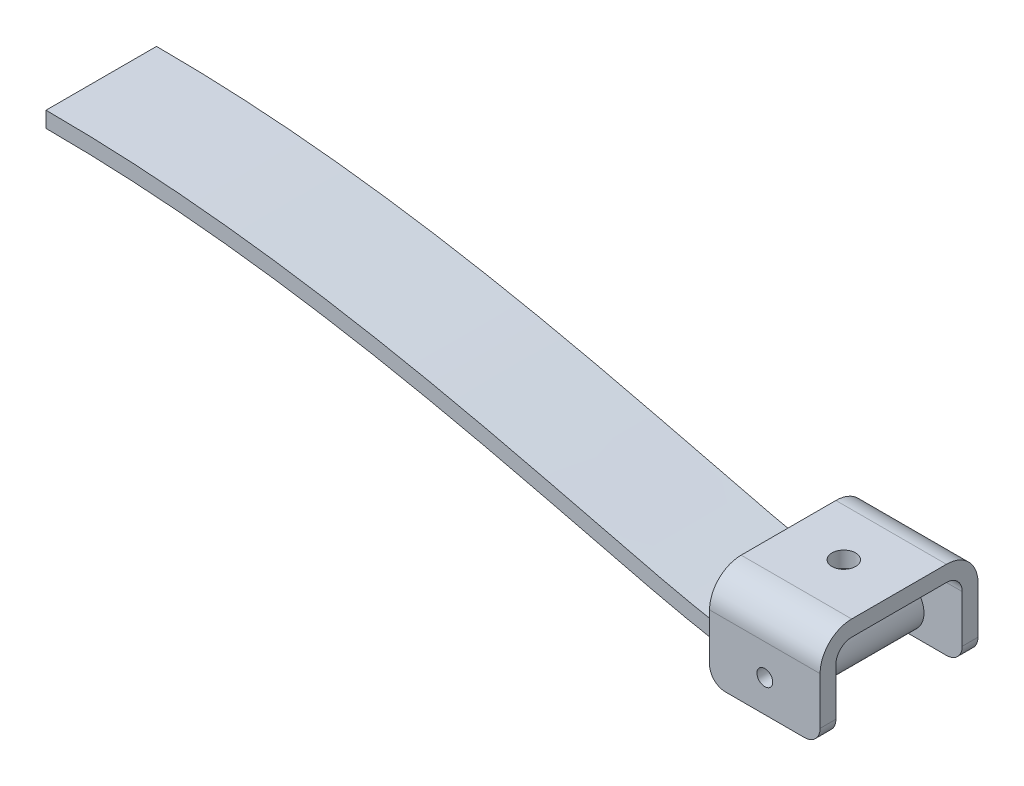
ISO-10303-21;
HEADER;
FILE_DESCRIPTION(('STEP AP214'),'2;1');
FILE_NAME('part.step','',(''),(''),'','','');
FILE_SCHEMA(('AUTOMOTIVE_DESIGN { 1 0 10303 214 1 1 1 1 }'));
ENDSEC;
DATA;
#1=APPLICATION_CONTEXT('core data for automotive mechanical design processes');
#2=APPLICATION_PROTOCOL_DEFINITION('international standard','automotive_design',2000,#1);
#3=PRODUCT_CONTEXT('',#1,'mechanical');
#4=PRODUCT('Part','Part','',(#3));
#5=PRODUCT_RELATED_PRODUCT_CATEGORY('part','',(#4));
#6=PRODUCT_DEFINITION_FORMATION('','',#4);
#7=PRODUCT_DEFINITION_CONTEXT('part definition',#1,'design');
#8=PRODUCT_DEFINITION('design','',#6,#7);
#9=PRODUCT_DEFINITION_SHAPE('','',#8);
#10=(LENGTH_UNIT() NAMED_UNIT(*) SI_UNIT(.MILLI.,.METRE.));
#11=(NAMED_UNIT(*) PLANE_ANGLE_UNIT() SI_UNIT($,.RADIAN.));
#12=(NAMED_UNIT(*) SI_UNIT($,.STERADIAN.) SOLID_ANGLE_UNIT());
#13=UNCERTAINTY_MEASURE_WITH_UNIT(LENGTH_MEASURE(1.E-05),#10,'distance_accuracy_value','');
#14=(GEOMETRIC_REPRESENTATION_CONTEXT(3) GLOBAL_UNCERTAINTY_ASSIGNED_CONTEXT((#13)) GLOBAL_UNIT_ASSIGNED_CONTEXT((#10,
#11,#12)) REPRESENTATION_CONTEXT('',''));
#15=CARTESIAN_POINT('',(0.,0.,0.));
#16=DIRECTION('',(0.,0.,1.));
#17=DIRECTION('',(1.,0.,0.));
#18=AXIS2_PLACEMENT_3D('',#15,#16,#17);
#19=CARTESIAN_POINT('',(31.75,15.6569971708173,-24.9059716634552));
#20=DIRECTION('',(0.,0.,-1.));
#21=DIRECTION('',(-1.,0.,0.));
#22=AXIS2_PLACEMENT_3D('',#19,#20,#21);
#23=PLANE('',#22);
#24=CARTESIAN_POINT('',(9.525,3.175,-24.9059716634552));
#25=DIRECTION('',(0.,0.,-1.));
#26=DIRECTION('',(-1.,0.,0.));
#27=AXIS2_PLACEMENT_3D('',#24,#25,#26);
#28=CIRCLE('',#27,3.175);
#29=CARTESIAN_POINT('',(6.35,3.175,-24.9059716634552));
#30=VERTEX_POINT('',#29);
#31=EDGE_CURVE('E207',#30,#30,#28,.T.);
#32=ORIENTED_EDGE('',*,*,#31,.T.);
#33=EDGE_LOOP('',(#32));
#34=FACE_BOUND('',#33,.T.);
#35=DIRECTION('',(-1.,0.,0.));
#36=VECTOR('',#35,1.);
#37=CARTESIAN_POINT('',(31.75,-9.74300282918273,-24.9059716634552));
#38=LINE('',#37,#36);
#39=CARTESIAN_POINT('',(25.4,-9.74300282918273,-24.9059716634552));
#40=VERTEX_POINT('',#39);
#41=CARTESIAN_POINT('',(-6.35,-9.74300282918273,-24.9059716634552));
#42=VERTEX_POINT('',#41);
#43=EDGE_CURVE('E251',#40,#42,#38,.T.);
#44=ORIENTED_EDGE('',*,*,#43,.F.);
#45=CARTESIAN_POINT('',(25.4,-3.39300282918273,-24.9059716634552));
#46=DIRECTION('',(0.,0.,-1.));
#47=DIRECTION('',(-1.,0.,0.));
#48=AXIS2_PLACEMENT_3D('',#45,#46,#47);
#49=CIRCLE('',#48,6.35);
#50=CARTESIAN_POINT('',(31.75,-3.39300282918273,-24.9059716634552));
#51=VERTEX_POINT('',#50);
#52=EDGE_CURVE('E265',#40,#51,#49,.F.);
#53=ORIENTED_EDGE('',*,*,#52,.T.);
#54=DIRECTION('',(0.,1.,0.));
#55=VECTOR('',#54,1.);
#56=CARTESIAN_POINT('',(31.75,15.6569971708173,-24.9059716634552));
#57=LINE('',#56,#55);
#58=CARTESIAN_POINT('',(31.75,15.6569971708173,-24.9059716634552));
#59=VERTEX_POINT('',#58);
#60=EDGE_CURVE('E182',#59,#51,#57,.F.);
#61=ORIENTED_EDGE('',*,*,#60,.F.);
#62=DIRECTION('',(-1.,0.,0.));
#63=VECTOR('',#62,1.);
#64=CARTESIAN_POINT('',(31.75,15.6569971708173,-24.9059716634552));
#65=LINE('',#64,#63);
#66=CARTESIAN_POINT('',(-12.7,15.6569971708173,-24.9059716634552));
#67=VERTEX_POINT('',#66);
#68=EDGE_CURVE('E203',#59,#67,#65,.T.);
#69=ORIENTED_EDGE('',*,*,#68,.T.);
#70=DIRECTION('',(0.,1.,0.));
#71=VECTOR('',#70,1.);
#72=CARTESIAN_POINT('',(-12.7,15.6569971708173,-24.9059716634552));
#73=LINE('',#72,#71);
#74=CARTESIAN_POINT('',(-12.7,-3.39300282918273,-24.9059716634552));
#75=VERTEX_POINT('',#74);
#76=EDGE_CURVE('E204',#67,#75,#73,.F.);
#77=ORIENTED_EDGE('',*,*,#76,.T.);
#78=CARTESIAN_POINT('',(-6.35,-3.39300282918273,-24.9059716634552));
#79=DIRECTION('',(0.,0.,-1.));
#80=DIRECTION('',(-1.,0.,0.));
#81=AXIS2_PLACEMENT_3D('',#78,#79,#80);
#82=CIRCLE('',#81,6.35);
#83=EDGE_CURVE('E263',#75,#42,#82,.F.);
#84=ORIENTED_EDGE('',*,*,#83,.T.);
#85=EDGE_LOOP('',(#44,#53,#61,#69,#77,#84));
#86=FACE_BOUND('',#85,.T.);
#87=ADVANCED_FACE('F45',(#34,#86),#23,.F.);
#88=CARTESIAN_POINT('',(31.75,-9.74300282918273,-31.2559716634552));
#89=DIRECTION('',(0.,-1.,0.));
#90=DIRECTION('',(0.,0.,-1.));
#91=AXIS2_PLACEMENT_3D('',#88,#89,#90);
#92=PLANE('',#91);
#93=DIRECTION('',(-1.,0.,0.));
#94=VECTOR('',#93,1.);
#95=CARTESIAN_POINT('',(31.75,-9.74300282918273,-31.2559716634552));
#96=LINE('',#95,#94);
#97=CARTESIAN_POINT('',(25.4,-9.74300282918273,-31.2559716634552));
#98=VERTEX_POINT('',#97);
#99=CARTESIAN_POINT('',(-6.35,-9.74300282918273,-31.2559716634552));
#100=VERTEX_POINT('',#99);
#101=EDGE_CURVE('E170',#98,#100,#96,.T.);
#102=ORIENTED_EDGE('',*,*,#101,.F.);
#103=DIRECTION('',(0.,0.,1.));
#104=VECTOR('',#103,1.);
#105=CARTESIAN_POINT('',(25.4,-9.74300282918273,-24.9059716634552));
#106=LINE('',#105,#104);
#107=EDGE_CURVE('E260',#98,#40,#106,.T.);
#108=ORIENTED_EDGE('',*,*,#107,.T.);
#109=ORIENTED_EDGE('',*,*,#43,.T.);
#110=DIRECTION('',(0.,0.,1.));
#111=VECTOR('',#110,1.);
#112=CARTESIAN_POINT('',(-6.35,-9.74300282918273,-31.2559716634552));
#113=LINE('',#112,#111);
#114=EDGE_CURVE('E254',#42,#100,#113,.F.);
#115=ORIENTED_EDGE('',*,*,#114,.T.);
#116=EDGE_LOOP('',(#102,#108,#109,#115));
#117=FACE_BOUND('',#116,.T.);
#118=ADVANCED_FACE('F328',(#117),#92,.T.);
#119=CARTESIAN_POINT('',(31.75,15.6569971708173,-31.2559716634552));
#120=DIRECTION('',(0.,0.,-1.));
#121=DIRECTION('',(-1.,0.,0.));
#122=AXIS2_PLACEMENT_3D('',#119,#120,#121);
#123=PLANE('',#122);
#124=CARTESIAN_POINT('',(9.525,3.175,-31.2559716634552));
#125=DIRECTION('',(0.,0.,1.));
#126=DIRECTION('',(1.,0.,0.));
#127=AXIS2_PLACEMENT_3D('',#124,#125,#126);
#128=CIRCLE('',#127,3.175);
#129=CARTESIAN_POINT('',(12.7,3.175,-31.2559716634552));
#130=VERTEX_POINT('',#129);
#131=EDGE_CURVE('E258',#130,#130,#128,.T.);
#132=ORIENTED_EDGE('',*,*,#131,.T.);
#133=EDGE_LOOP('',(#132));
#134=FACE_BOUND('',#133,.T.);
#135=DIRECTION('',(0.,-1.,0.));
#136=VECTOR('',#135,1.);
#137=CARTESIAN_POINT('',(31.75,15.6569971708173,-31.2559716634552));
#138=LINE('',#137,#136);
#139=CARTESIAN_POINT('',(31.75,15.6569971708173,-31.2559716634552));
#140=VERTEX_POINT('',#139);
#141=CARTESIAN_POINT('',(31.75,-3.39300282918273,-31.2559716634552));
#142=VERTEX_POINT('',#141);
#143=EDGE_CURVE('E162',#140,#142,#138,.T.);
#144=ORIENTED_EDGE('',*,*,#143,.T.);
#145=CARTESIAN_POINT('',(25.4,-3.39300282918273,-31.2559716634552));
#146=DIRECTION('',(0.,0.,-1.));
#147=DIRECTION('',(-1.,0.,0.));
#148=AXIS2_PLACEMENT_3D('',#145,#146,#147);
#149=CIRCLE('',#148,6.35);
#150=EDGE_CURVE('E272',#142,#98,#149,.T.);
#151=ORIENTED_EDGE('',*,*,#150,.T.);
#152=ORIENTED_EDGE('',*,*,#101,.T.);
#153=CARTESIAN_POINT('',(-6.35,-3.39300282918273,-31.2559716634552));
#154=DIRECTION('',(0.,0.,-1.));
#155=DIRECTION('',(-1.,0.,0.));
#156=AXIS2_PLACEMENT_3D('',#153,#154,#155);
#157=CIRCLE('',#156,6.35);
#158=CARTESIAN_POINT('',(-12.7,-3.39300282918273,-31.2559716634552));
#159=VERTEX_POINT('',#158);
#160=EDGE_CURVE('E270',#100,#159,#157,.T.);
#161=ORIENTED_EDGE('',*,*,#160,.T.);
#162=DIRECTION('',(0.,-1.,0.));
#163=VECTOR('',#162,1.);
#164=CARTESIAN_POINT('',(-12.7,15.6569971708173,-31.2559716634552));
#165=LINE('',#164,#163);
#166=CARTESIAN_POINT('',(-12.7,15.6569971708173,-31.2559716634552));
#167=VERTEX_POINT('',#166);
#168=EDGE_CURVE('E165',#167,#159,#165,.T.);
#169=ORIENTED_EDGE('',*,*,#168,.F.);
#170=DIRECTION('',(-1.,0.,0.));
#171=VECTOR('',#170,1.);
#172=CARTESIAN_POINT('',(31.75,15.6569971708173,-31.2559716634552));
#173=LINE('',#172,#171);
#174=EDGE_CURVE('E159',#140,#167,#173,.T.);
#175=ORIENTED_EDGE('',*,*,#174,.F.);
#176=EDGE_LOOP('',(#144,#151,#152,#161,#169,#175));
#177=FACE_BOUND('',#176,.T.);
#178=ADVANCED_FACE('F161',(#134,#177),#123,.T.);
#179=CARTESIAN_POINT('',(31.75,15.6569971708173,-18.5559716634552));
#180=DIRECTION('',(-1.,0.,0.));
#181=DIRECTION('',(0.,0.,1.));
#182=AXIS2_PLACEMENT_3D('',#179,#180,#181);
#183=CYLINDRICAL_SURFACE('',#182,12.7);
#184=CARTESIAN_POINT('',(-12.7,15.6569971708173,-18.5559716634552));
#185=DIRECTION('',(-1.,0.,0.));
#186=DIRECTION('',(0.,0.,1.));
#187=AXIS2_PLACEMENT_3D('',#184,#185,#186);
#188=CIRCLE('',#187,12.7);
#189=CARTESIAN_POINT('',(-12.7,28.3569971708173,-18.5559716634552));
#190=VERTEX_POINT('',#189);
#191=EDGE_CURVE('E209',#190,#167,#188,.T.);
#192=ORIENTED_EDGE('',*,*,#191,.F.);
#193=DIRECTION('',(-1.,0.,0.));
#194=VECTOR('',#193,1.);
#195=CARTESIAN_POINT('',(31.75,28.3569971708173,-18.5559716634552));
#196=LINE('',#195,#194);
#197=CARTESIAN_POINT('',(31.75,28.3569971708173,-18.5559716634552));
#198=VERTEX_POINT('',#197);
#199=EDGE_CURVE('E171',#198,#190,#196,.T.);
#200=ORIENTED_EDGE('',*,*,#199,.F.);
#201=CARTESIAN_POINT('',(31.75,15.6569971708173,-18.5559716634552));
#202=DIRECTION('',(-1.,0.,0.));
#203=DIRECTION('',(0.,0.,1.));
#204=AXIS2_PLACEMENT_3D('',#201,#202,#203);
#205=CIRCLE('',#204,12.7);
#206=EDGE_CURVE('E178',#198,#140,#205,.T.);
#207=ORIENTED_EDGE('',*,*,#206,.T.);
#208=ORIENTED_EDGE('',*,*,#174,.T.);
#209=EDGE_LOOP('',(#192,#200,#207,#208));
#210=FACE_BOUND('',#209,.T.);
#211=ADVANCED_FACE('F184',(#210),#183,.T.);
#212=CARTESIAN_POINT('',(31.75,28.3569971708173,19.5440283365448));
#213=DIRECTION('',(0.,1.,0.));
#214=DIRECTION('',(0.,0.,1.));
#215=AXIS2_PLACEMENT_3D('',#212,#213,#214);
#216=PLANE('',#215);
#217=CARTESIAN_POINT('',(9.525,28.3569971708173,0.494028336544765));
#218=DIRECTION('',(0.,1.,0.));
#219=DIRECTION('',(0.,0.,1.));
#220=AXIS2_PLACEMENT_3D('',#217,#218,#219);
#221=CIRCLE('',#220,4.7625);
#222=CARTESIAN_POINT('',(9.525,28.3569971708173,5.25652833654476));
#223=VERTEX_POINT('',#222);
#224=EDGE_CURVE('E491',#223,#223,#221,.T.);
#225=ORIENTED_EDGE('',*,*,#224,.F.);
#226=EDGE_LOOP('',(#225));
#227=FACE_BOUND('',#226,.T.);
#228=DIRECTION('',(0.,0.,-1.));
#229=VECTOR('',#228,1.);
#230=CARTESIAN_POINT('',(-12.7,28.3569971708173,19.5440283365448));
#231=LINE('',#230,#229);
#232=CARTESIAN_POINT('',(-12.7,28.3569971708173,19.5440283365448));
#233=VERTEX_POINT('',#232);
#234=EDGE_CURVE('E211',#233,#190,#231,.T.);
#235=ORIENTED_EDGE('',*,*,#234,.F.);
#236=DIRECTION('',(-1.,0.,0.));
#237=VECTOR('',#236,1.);
#238=CARTESIAN_POINT('',(31.75,28.3569971708173,19.5440283365448));
#239=LINE('',#238,#237);
#240=CARTESIAN_POINT('',(31.75,28.3569971708173,19.5440283365448));
#241=VERTEX_POINT('',#240);
#242=EDGE_CURVE('E246',#241,#233,#239,.T.);
#243=ORIENTED_EDGE('',*,*,#242,.F.);
#244=DIRECTION('',(0.,0.,-1.));
#245=VECTOR('',#244,1.);
#246=CARTESIAN_POINT('',(31.75,28.3569971708173,19.5440283365448));
#247=LINE('',#246,#245);
#248=EDGE_CURVE('E185',#241,#198,#247,.T.);
#249=ORIENTED_EDGE('',*,*,#248,.T.);
#250=ORIENTED_EDGE('',*,*,#199,.T.);
#251=EDGE_LOOP('',(#235,#243,#249,#250));
#252=FACE_BOUND('',#251,.T.);
#253=ADVANCED_FACE('F338',(#227,#252),#216,.T.);
#254=CARTESIAN_POINT('',(31.75,15.6569971708173,19.5440283365448));
#255=DIRECTION('',(-1.,0.,0.));
#256=DIRECTION('',(0.,0.,1.));
#257=AXIS2_PLACEMENT_3D('',#254,#255,#256);
#258=CYLINDRICAL_SURFACE('',#257,12.7);
#259=CARTESIAN_POINT('',(-12.7,15.6569971708173,19.5440283365448));
#260=DIRECTION('',(-1.,0.,0.));
#261=DIRECTION('',(0.,0.,1.));
#262=AXIS2_PLACEMENT_3D('',#259,#260,#261);
#263=CIRCLE('',#262,12.7);
#264=CARTESIAN_POINT('',(-12.7,15.6569971708173,32.2440283365448));
#265=VERTEX_POINT('',#264);
#266=EDGE_CURVE('E214',#265,#233,#263,.T.);
#267=ORIENTED_EDGE('',*,*,#266,.F.);
#268=DIRECTION('',(-1.,0.,0.));
#269=VECTOR('',#268,1.);
#270=CARTESIAN_POINT('',(31.75,15.6569971708173,32.2440283365448));
#271=LINE('',#270,#269);
#272=CARTESIAN_POINT('',(31.75,15.6569971708173,32.2440283365448));
#273=VERTEX_POINT('',#272);
#274=EDGE_CURVE('E243',#273,#265,#271,.T.);
#275=ORIENTED_EDGE('',*,*,#274,.F.);
#276=CARTESIAN_POINT('',(31.75,15.6569971708173,19.5440283365448));
#277=DIRECTION('',(-1.,0.,0.));
#278=DIRECTION('',(0.,0.,1.));
#279=AXIS2_PLACEMENT_3D('',#276,#277,#278);
#280=CIRCLE('',#279,12.7);
#281=EDGE_CURVE('E187',#273,#241,#280,.T.);
#282=ORIENTED_EDGE('',*,*,#281,.T.);
#283=ORIENTED_EDGE('',*,*,#242,.T.);
#284=EDGE_LOOP('',(#267,#275,#282,#283));
#285=FACE_BOUND('',#284,.T.);
#286=ADVANCED_FACE('F340',(#285),#258,.T.);
#287=CARTESIAN_POINT('',(31.75,-9.74300282918272,32.2440283365448));
#288=DIRECTION('',(0.,0.,1.));
#289=DIRECTION('',(1.,0.,0.));
#290=AXIS2_PLACEMENT_3D('',#287,#288,#289);
#291=PLANE('',#290);
#292=CARTESIAN_POINT('',(9.525,3.175,32.2440283365448));
#293=DIRECTION('',(0.,0.,1.));
#294=DIRECTION('',(1.,0.,0.));
#295=AXIS2_PLACEMENT_3D('',#292,#293,#294);
#296=CIRCLE('',#295,3.175);
#297=CARTESIAN_POINT('',(12.7,3.175,32.2440283365448));
#298=VERTEX_POINT('',#297);
#299=EDGE_CURVE('E484',#298,#298,#296,.T.);
#300=ORIENTED_EDGE('',*,*,#299,.F.);
#301=EDGE_LOOP('',(#300));
#302=FACE_BOUND('',#301,.T.);
#303=DIRECTION('',(-1.,0.,0.));
#304=VECTOR('',#303,1.);
#305=CARTESIAN_POINT('',(31.75,-9.74300282918272,32.2440283365448));
#306=LINE('',#305,#304);
#307=CARTESIAN_POINT('',(25.4,-9.74300282918272,32.2440283365448));
#308=VERTEX_POINT('',#307);
#309=CARTESIAN_POINT('',(-6.35,-9.74300282918272,32.2440283365448));
#310=VERTEX_POINT('',#309);
#311=EDGE_CURVE('E241',#308,#310,#306,.T.);
#312=ORIENTED_EDGE('',*,*,#311,.F.);
#313=CARTESIAN_POINT('',(25.4,-3.39300282918272,32.2440283365448));
#314=DIRECTION('',(0.,0.,1.));
#315=DIRECTION('',(1.,0.,0.));
#316=AXIS2_PLACEMENT_3D('',#313,#314,#315);
#317=CIRCLE('',#316,6.35);
#318=CARTESIAN_POINT('',(31.75,-3.39300282918272,32.2440283365448));
#319=VERTEX_POINT('',#318);
#320=EDGE_CURVE('E68',#308,#319,#317,.T.);
#321=ORIENTED_EDGE('',*,*,#320,.T.);
#322=DIRECTION('',(0.,1.,0.));
#323=VECTOR('',#322,1.);
#324=CARTESIAN_POINT('',(31.75,-9.74300282918272,32.2440283365448));
#325=LINE('',#324,#323);
#326=EDGE_CURVE('E193',#319,#273,#325,.T.);
#327=ORIENTED_EDGE('',*,*,#326,.T.);
#328=ORIENTED_EDGE('',*,*,#274,.T.);
#329=DIRECTION('',(0.,1.,0.));
#330=VECTOR('',#329,1.);
#331=CARTESIAN_POINT('',(-12.7,-9.74300282918272,32.2440283365448));
#332=LINE('',#331,#330);
#333=CARTESIAN_POINT('',(-12.7,-3.39300282918273,32.2440283365448));
#334=VERTEX_POINT('',#333);
#335=EDGE_CURVE('E217',#334,#265,#332,.T.);
#336=ORIENTED_EDGE('',*,*,#335,.F.);
#337=CARTESIAN_POINT('',(-6.35,-3.39300282918273,32.2440283365448));
#338=DIRECTION('',(0.,0.,1.));
#339=DIRECTION('',(1.,0.,0.));
#340=AXIS2_PLACEMENT_3D('',#337,#338,#339);
#341=CIRCLE('',#340,6.35);
#342=EDGE_CURVE('E60',#334,#310,#341,.T.);
#343=ORIENTED_EDGE('',*,*,#342,.T.);
#344=EDGE_LOOP('',(#312,#321,#327,#328,#336,#343));
#345=FACE_BOUND('',#344,.T.);
#346=ADVANCED_FACE('F301',(#302,#345),#291,.T.);
#347=CARTESIAN_POINT('',(31.75,-9.74300282918272,25.8940283365448));
#348=DIRECTION('',(0.,-1.,0.));
#349=DIRECTION('',(0.,0.,-1.));
#350=AXIS2_PLACEMENT_3D('',#347,#348,#349);
#351=PLANE('',#350);
#352=DIRECTION('',(-1.,0.,0.));
#353=VECTOR('',#352,1.);
#354=CARTESIAN_POINT('',(31.75,-9.74300282918272,25.8940283365448));
#355=LINE('',#354,#353);
#356=CARTESIAN_POINT('',(25.4,-9.74300282918272,25.8940283365448));
#357=VERTEX_POINT('',#356);
#358=CARTESIAN_POINT('',(-6.35,-9.74300282918272,25.8940283365448));
#359=VERTEX_POINT('',#358);
#360=EDGE_CURVE('E238',#357,#359,#355,.T.);
#361=ORIENTED_EDGE('',*,*,#360,.F.);
#362=DIRECTION('',(0.,0.,1.));
#363=VECTOR('',#362,1.);
#364=CARTESIAN_POINT('',(25.4,-9.74300282918272,32.2440283365448));
#365=LINE('',#364,#363);
#366=EDGE_CURVE('E282',#357,#308,#365,.T.);
#367=ORIENTED_EDGE('',*,*,#366,.T.);
#368=ORIENTED_EDGE('',*,*,#311,.T.);
#369=DIRECTION('',(0.,0.,1.));
#370=VECTOR('',#369,1.);
#371=CARTESIAN_POINT('',(-6.35,-9.74300282918272,25.8940283365448));
#372=LINE('',#371,#370);
#373=EDGE_CURVE('E280',#310,#359,#372,.F.);
#374=ORIENTED_EDGE('',*,*,#373,.T.);
#375=EDGE_LOOP('',(#361,#367,#368,#374));
#376=FACE_BOUND('',#375,.T.);
#377=ADVANCED_FACE('F300',(#376),#351,.T.);
#378=CARTESIAN_POINT('',(31.75,-9.74300282918272,25.8940283365448));
#379=DIRECTION('',(0.,0.,1.));
#380=DIRECTION('',(1.,0.,0.));
#381=AXIS2_PLACEMENT_3D('',#378,#379,#380);
#382=PLANE('',#381);
#383=CARTESIAN_POINT('',(9.525,3.175,25.8940283365448));
#384=DIRECTION('',(0.,0.,1.));
#385=DIRECTION('',(1.,0.,0.));
#386=AXIS2_PLACEMENT_3D('',#383,#384,#385);
#387=CIRCLE('',#386,3.175);
#388=CARTESIAN_POINT('',(12.7,3.175,25.8940283365448));
#389=VERTEX_POINT('',#388);
#390=EDGE_CURVE('E255',#389,#389,#387,.T.);
#391=ORIENTED_EDGE('',*,*,#390,.T.);
#392=EDGE_LOOP('',(#391));
#393=FACE_BOUND('',#392,.T.);
#394=DIRECTION('',(0.,1.,0.));
#395=VECTOR('',#394,1.);
#396=CARTESIAN_POINT('',(31.75,-9.74300282918272,25.8940283365448));
#397=LINE('',#396,#395);
#398=CARTESIAN_POINT('',(31.75,-3.39300282918272,25.8940283365448));
#399=VERTEX_POINT('',#398);
#400=CARTESIAN_POINT('',(31.75,15.6569971708173,25.8940283365448));
#401=VERTEX_POINT('',#400);
#402=EDGE_CURVE('E195',#399,#401,#397,.T.);
#403=ORIENTED_EDGE('',*,*,#402,.F.);
#404=CARTESIAN_POINT('',(25.4,-3.39300282918272,25.8940283365448));
#405=DIRECTION('',(0.,0.,1.));
#406=DIRECTION('',(1.,0.,0.));
#407=AXIS2_PLACEMENT_3D('',#404,#405,#406);
#408=CIRCLE('',#407,6.35);
#409=EDGE_CURVE('E12',#399,#357,#408,.F.);
#410=ORIENTED_EDGE('',*,*,#409,.T.);
#411=ORIENTED_EDGE('',*,*,#360,.T.);
#412=CARTESIAN_POINT('',(-6.35,-3.39300282918273,25.8940283365448));
#413=DIRECTION('',(0.,0.,1.));
#414=DIRECTION('',(1.,0.,0.));
#415=AXIS2_PLACEMENT_3D('',#412,#413,#414);
#416=CIRCLE('',#415,6.35);
#417=CARTESIAN_POINT('',(-12.7,-3.39300282918273,25.8940283365448));
#418=VERTEX_POINT('',#417);
#419=EDGE_CURVE('E53',#359,#418,#416,.F.);
#420=ORIENTED_EDGE('',*,*,#419,.T.);
#421=DIRECTION('',(0.,1.,0.));
#422=VECTOR('',#421,1.);
#423=CARTESIAN_POINT('',(-12.7,-9.74300282918272,25.8940283365448));
#424=LINE('',#423,#422);
#425=CARTESIAN_POINT('',(-12.7,15.6569971708173,25.8940283365448));
#426=VERTEX_POINT('',#425);
#427=EDGE_CURVE('E219',#418,#426,#424,.T.);
#428=ORIENTED_EDGE('',*,*,#427,.T.);
#429=DIRECTION('',(-1.,0.,0.));
#430=VECTOR('',#429,1.);
#431=CARTESIAN_POINT('',(31.75,15.6569971708173,25.8940283365448));
#432=LINE('',#431,#430);
#433=EDGE_CURVE('E235',#401,#426,#432,.T.);
#434=ORIENTED_EDGE('',*,*,#433,.F.);
#435=EDGE_LOOP('',(#403,#410,#411,#420,#428,#434));
#436=FACE_BOUND('',#435,.T.);
#437=ADVANCED_FACE('F289',(#393,#436),#382,.F.);
#438=CARTESIAN_POINT('',(31.75,15.6569971708173,19.5440283365448));
#439=DIRECTION('',(-1.,0.,0.));
#440=DIRECTION('',(0.,0.,1.));
#441=AXIS2_PLACEMENT_3D('',#438,#439,#440);
#442=CYLINDRICAL_SURFACE('',#441,6.35);
#443=CARTESIAN_POINT('',(-12.7,15.6569971708173,19.5440283365448));
#444=DIRECTION('',(1.,0.,0.));
#445=DIRECTION('',(0.,0.,-1.));
#446=AXIS2_PLACEMENT_3D('',#443,#444,#445);
#447=CIRCLE('',#446,6.35);
#448=CARTESIAN_POINT('',(-12.7,22.0069971708173,19.5440283365448));
#449=VERTEX_POINT('',#448);
#450=EDGE_CURVE('E221',#426,#449,#447,.F.);
#451=ORIENTED_EDGE('',*,*,#450,.T.);
#452=DIRECTION('',(-1.,0.,0.));
#453=VECTOR('',#452,1.);
#454=CARTESIAN_POINT('',(31.75,22.0069971708173,19.5440283365448));
#455=LINE('',#454,#453);
#456=CARTESIAN_POINT('',(31.75,22.0069971708173,19.5440283365448));
#457=VERTEX_POINT('',#456);
#458=EDGE_CURVE('E232',#457,#449,#455,.T.);
#459=ORIENTED_EDGE('',*,*,#458,.F.);
#460=CARTESIAN_POINT('',(31.75,15.6569971708173,19.5440283365448));
#461=DIRECTION('',(1.,0.,0.));
#462=DIRECTION('',(0.,0.,-1.));
#463=AXIS2_PLACEMENT_3D('',#460,#461,#462);
#464=CIRCLE('',#463,6.35);
#465=EDGE_CURVE('E197',#401,#457,#464,.F.);
#466=ORIENTED_EDGE('',*,*,#465,.F.);
#467=ORIENTED_EDGE('',*,*,#433,.T.);
#468=EDGE_LOOP('',(#451,#459,#466,#467));
#469=FACE_BOUND('',#468,.T.);
#470=ADVANCED_FACE('F312',(#469),#442,.F.);
#471=CARTESIAN_POINT('',(31.75,22.0069971708173,19.5440283365448));
#472=DIRECTION('',(0.,1.,0.));
#473=DIRECTION('',(0.,0.,1.));
#474=AXIS2_PLACEMENT_3D('',#471,#472,#473);
#475=PLANE('',#474);
#476=CARTESIAN_POINT('',(9.525,22.0069971708173,0.494028336544765));
#477=DIRECTION('',(0.,1.,0.));
#478=DIRECTION('',(0.,0.,1.));
#479=AXIS2_PLACEMENT_3D('',#476,#477,#478);
#480=CIRCLE('',#479,4.7625);
#481=CARTESIAN_POINT('',(9.525,22.0069971708173,5.25652833654476));
#482=VERTEX_POINT('',#481);
#483=EDGE_CURVE('E486',#482,#482,#480,.T.);
#484=ORIENTED_EDGE('',*,*,#483,.T.);
#485=EDGE_LOOP('',(#484));
#486=FACE_BOUND('',#485,.T.);
#487=DIRECTION('',(0.,0.,-1.));
#488=VECTOR('',#487,1.);
#489=CARTESIAN_POINT('',(-12.7,22.0069971708173,19.5440283365448));
#490=LINE('',#489,#488);
#491=CARTESIAN_POINT('',(-12.7,22.0069971708173,-18.5559716634552));
#492=VERTEX_POINT('',#491);
#493=EDGE_CURVE('E223',#449,#492,#490,.T.);
#494=ORIENTED_EDGE('',*,*,#493,.T.);
#495=DIRECTION('',(-1.,0.,0.));
#496=VECTOR('',#495,1.);
#497=CARTESIAN_POINT('',(31.75,22.0069971708173,-18.5559716634552));
#498=LINE('',#497,#496);
#499=CARTESIAN_POINT('',(31.75,22.0069971708173,-18.5559716634552));
#500=VERTEX_POINT('',#499);
#501=EDGE_CURVE('E229',#500,#492,#498,.T.);
#502=ORIENTED_EDGE('',*,*,#501,.F.);
#503=DIRECTION('',(0.,0.,-1.));
#504=VECTOR('',#503,1.);
#505=CARTESIAN_POINT('',(31.75,22.0069971708173,19.5440283365448));
#506=LINE('',#505,#504);
#507=EDGE_CURVE('E199',#457,#500,#506,.T.);
#508=ORIENTED_EDGE('',*,*,#507,.F.);
#509=ORIENTED_EDGE('',*,*,#458,.T.);
#510=EDGE_LOOP('',(#494,#502,#508,#509));
#511=FACE_BOUND('',#510,.T.);
#512=ADVANCED_FACE('F314',(#486,#511),#475,.F.);
#513=CARTESIAN_POINT('',(31.75,15.6569971708173,-18.5559716634552));
#514=DIRECTION('',(-1.,0.,0.));
#515=DIRECTION('',(0.,0.,1.));
#516=AXIS2_PLACEMENT_3D('',#513,#514,#515);
#517=CYLINDRICAL_SURFACE('',#516,6.35);
#518=CARTESIAN_POINT('',(-12.7,15.6569971708173,-18.5559716634552));
#519=DIRECTION('',(1.,0.,0.));
#520=DIRECTION('',(0.,0.,-1.));
#521=AXIS2_PLACEMENT_3D('',#518,#519,#520);
#522=CIRCLE('',#521,6.35);
#523=EDGE_CURVE('E225',#492,#67,#522,.F.);
#524=ORIENTED_EDGE('',*,*,#523,.T.);
#525=ORIENTED_EDGE('',*,*,#68,.F.);
#526=CARTESIAN_POINT('',(31.75,15.6569971708173,-18.5559716634552));
#527=DIRECTION('',(1.,0.,0.));
#528=DIRECTION('',(0.,0.,-1.));
#529=AXIS2_PLACEMENT_3D('',#526,#527,#528);
#530=CIRCLE('',#529,6.35);
#531=EDGE_CURVE('E201',#500,#59,#530,.F.);
#532=ORIENTED_EDGE('',*,*,#531,.F.);
#533=ORIENTED_EDGE('',*,*,#501,.T.);
#534=EDGE_LOOP('',(#524,#525,#532,#533));
#535=FACE_BOUND('',#534,.T.);
#536=ADVANCED_FACE('F319',(#535),#517,.F.);
#537=CARTESIAN_POINT('',(31.75,15.6569971708173,-18.5559716634552));
#538=DIRECTION('',(-1.,0.,0.));
#539=DIRECTION('',(0.,0.,1.));
#540=AXIS2_PLACEMENT_3D('',#537,#538,#539);
#541=PLANE('',#540);
#542=ORIENTED_EDGE('',*,*,#60,.T.);
#543=DIRECTION('',(0.,0.,1.));
#544=VECTOR('',#543,1.);
#545=CARTESIAN_POINT('',(31.75,-3.39300282918273,-31.2559716634552));
#546=LINE('',#545,#544);
#547=EDGE_CURVE('E181',#51,#142,#546,.F.);
#548=ORIENTED_EDGE('',*,*,#547,.T.);
#549=ORIENTED_EDGE('',*,*,#143,.F.);
#550=ORIENTED_EDGE('',*,*,#206,.F.);
#551=ORIENTED_EDGE('',*,*,#248,.F.);
#552=ORIENTED_EDGE('',*,*,#281,.F.);
#553=ORIENTED_EDGE('',*,*,#326,.F.);
#554=DIRECTION('',(0.,0.,1.));
#555=VECTOR('',#554,1.);
#556=CARTESIAN_POINT('',(31.75,-3.39300282918272,25.8940283365448));
#557=LINE('',#556,#555);
#558=EDGE_CURVE('E267',#319,#399,#557,.F.);
#559=ORIENTED_EDGE('',*,*,#558,.T.);
#560=ORIENTED_EDGE('',*,*,#402,.T.);
#561=ORIENTED_EDGE('',*,*,#465,.T.);
#562=ORIENTED_EDGE('',*,*,#507,.T.);
#563=ORIENTED_EDGE('',*,*,#531,.T.);
#564=EDGE_LOOP('',(#542,#548,#549,#550,#551,#552,#553,#559,#560,#561,#562,#563));
#565=FACE_BOUND('',#564,.T.);
#566=ADVANCED_FACE('F176',(#565),#541,.F.);
#567=CARTESIAN_POINT('',(-12.7,15.6569971708173,-18.5559716634552));
#568=DIRECTION('',(-1.,0.,0.));
#569=DIRECTION('',(0.,0.,1.));
#570=AXIS2_PLACEMENT_3D('',#567,#568,#569);
#571=PLANE('',#570);
#572=ORIENTED_EDGE('',*,*,#168,.T.);
#573=DIRECTION('',(0.,0.,1.));
#574=VECTOR('',#573,1.);
#575=CARTESIAN_POINT('',(-12.7,-3.39300282918273,-18.5559716634552));
#576=LINE('',#575,#574);
#577=EDGE_CURVE('E277',#159,#75,#576,.T.);
#578=ORIENTED_EDGE('',*,*,#577,.T.);
#579=ORIENTED_EDGE('',*,*,#76,.F.);
#580=ORIENTED_EDGE('',*,*,#523,.F.);
#581=ORIENTED_EDGE('',*,*,#493,.F.);
#582=ORIENTED_EDGE('',*,*,#450,.F.);
#583=ORIENTED_EDGE('',*,*,#427,.F.);
#584=DIRECTION('',(0.,0.,1.));
#585=VECTOR('',#584,1.);
#586=CARTESIAN_POINT('',(-12.7,-3.39300282918273,-18.5559716634552));
#587=LINE('',#586,#585);
#588=EDGE_CURVE('E274',#418,#334,#587,.T.);
#589=ORIENTED_EDGE('',*,*,#588,.T.);
#590=ORIENTED_EDGE('',*,*,#335,.T.);
#591=ORIENTED_EDGE('',*,*,#266,.T.);
#592=ORIENTED_EDGE('',*,*,#234,.T.);
#593=ORIENTED_EDGE('',*,*,#191,.T.);
#594=EDGE_LOOP('',(#572,#578,#579,#580,#581,#582,#583,#589,#590,#591,#592,#593));
#595=FACE_BOUND('',#594,.T.);
#596=ADVANCED_FACE('F297',(#595),#571,.T.);
#597=CARTESIAN_POINT('',(9.525,3.175,-31.2559716634552));
#598=DIRECTION('',(0.,0.,1.));
#599=DIRECTION('',(1.,0.,0.));
#600=AXIS2_PLACEMENT_3D('',#597,#598,#599);
#601=CYLINDRICAL_SURFACE('',#600,3.175);
#602=ORIENTED_EDGE('',*,*,#299,.T.);
#603=EDGE_LOOP('',(#602));
#604=FACE_BOUND('',#603,.T.);
#605=ORIENTED_EDGE('',*,*,#390,.F.);
#606=EDGE_LOOP('',(#605));
#607=FACE_BOUND('',#606,.T.);
#608=ADVANCED_FACE('F385',(#604,#607),#601,.F.);
#609=ORIENTED_EDGE('',*,*,#131,.F.);
#610=EDGE_LOOP('',(#609));
#611=FACE_BOUND('',#610,.T.);
#612=ORIENTED_EDGE('',*,*,#31,.F.);
#613=EDGE_LOOP('',(#612));
#614=FACE_BOUND('',#613,.T.);
#615=ADVANCED_FACE('F366',(#611,#614),#601,.F.);
#616=CARTESIAN_POINT('',(25.4,-3.39300282918273,-31.2559716634552));
#617=DIRECTION('',(0.,0.,-1.));
#618=DIRECTION('',(-1.,0.,0.));
#619=AXIS2_PLACEMENT_3D('',#616,#617,#618);
#620=CYLINDRICAL_SURFACE('',#619,6.35);
#621=ORIENTED_EDGE('',*,*,#150,.F.);
#622=ORIENTED_EDGE('',*,*,#547,.F.);
#623=ORIENTED_EDGE('',*,*,#52,.F.);
#624=ORIENTED_EDGE('',*,*,#107,.F.);
#625=EDGE_LOOP('',(#621,#622,#623,#624));
#626=FACE_BOUND('',#625,.T.);
#627=ADVANCED_FACE('F323',(#626),#620,.T.);
#628=CARTESIAN_POINT('',(-6.35,-3.39300282918273,-18.5559716634552));
#629=DIRECTION('',(0.,0.,1.));
#630=DIRECTION('',(1.,0.,0.));
#631=AXIS2_PLACEMENT_3D('',#628,#629,#630);
#632=CYLINDRICAL_SURFACE('',#631,6.35);
#633=ORIENTED_EDGE('',*,*,#160,.F.);
#634=ORIENTED_EDGE('',*,*,#114,.F.);
#635=ORIENTED_EDGE('',*,*,#83,.F.);
#636=ORIENTED_EDGE('',*,*,#577,.F.);
#637=EDGE_LOOP('',(#633,#634,#635,#636));
#638=FACE_BOUND('',#637,.T.);
#639=ADVANCED_FACE('F332',(#638),#632,.T.);
#640=CARTESIAN_POINT('',(25.4,-3.39300282918272,25.8940283365448));
#641=DIRECTION('',(0.,0.,-1.));
#642=DIRECTION('',(-1.,0.,0.));
#643=AXIS2_PLACEMENT_3D('',#640,#641,#642);
#644=CYLINDRICAL_SURFACE('',#643,6.35);
#645=ORIENTED_EDGE('',*,*,#409,.F.);
#646=ORIENTED_EDGE('',*,*,#558,.F.);
#647=ORIENTED_EDGE('',*,*,#320,.F.);
#648=ORIENTED_EDGE('',*,*,#366,.F.);
#649=EDGE_LOOP('',(#645,#646,#647,#648));
#650=FACE_BOUND('',#649,.T.);
#651=ADVANCED_FACE('F306',(#650),#644,.T.);
#652=CARTESIAN_POINT('',(-6.35,-3.39300282918273,-18.5559716634552));
#653=DIRECTION('',(0.,0.,1.));
#654=DIRECTION('',(1.,0.,0.));
#655=AXIS2_PLACEMENT_3D('',#652,#653,#654);
#656=CYLINDRICAL_SURFACE('',#655,6.35);
#657=ORIENTED_EDGE('',*,*,#419,.F.);
#658=ORIENTED_EDGE('',*,*,#373,.F.);
#659=ORIENTED_EDGE('',*,*,#342,.F.);
#660=ORIENTED_EDGE('',*,*,#588,.F.);
#661=EDGE_LOOP('',(#657,#658,#659,#660));
#662=FACE_BOUND('',#661,.T.);
#663=ADVANCED_FACE('F47',(#662),#656,.T.);
#664=CARTESIAN_POINT('',(9.525,22.0069971708173,0.494028336544765));
#665=DIRECTION('',(0.,1.,0.));
#666=DIRECTION('',(0.,0.,1.));
#667=AXIS2_PLACEMENT_3D('',#664,#665,#666);
#668=CYLINDRICAL_SURFACE('',#667,4.7625);
#669=ORIENTED_EDGE('',*,*,#483,.F.);
#670=EDGE_LOOP('',(#669));
#671=FACE_BOUND('',#670,.T.);
#672=ORIENTED_EDGE('',*,*,#224,.T.);
#673=EDGE_LOOP('',(#672));
#674=FACE_BOUND('',#673,.T.);
#675=ADVANCED_FACE('F372',(#671,#674),#668,.F.);
#676=CLOSED_SHELL('',(#87,#118,#178,#211,#253,#286,#346,#377,#437,#470,#512,#536,#566,#596,#608,
#615,#627,#639,#651,#663,#675));
#677=MANIFOLD_SOLID_BREP('B2',#676);
#678=CARTESIAN_POINT('',(-289.56,0.,22.225));
#679=DIRECTION('',(-1.,0.,0.));
#680=DIRECTION('',(0.,0.,1.));
#681=AXIS2_PLACEMENT_3D('',#678,#679,#680);
#682=PLANE('',#681);
#683=DIRECTION('',(0.,1.,0.));
#684=VECTOR('',#683,1.);
#685=CARTESIAN_POINT('',(-289.56,0.,-22.225));
#686=LINE('',#685,#684);
#687=CARTESIAN_POINT('',(-289.56,39.878,-22.225));
#688=VERTEX_POINT('',#687);
#689=CARTESIAN_POINT('',(-289.56,46.228,-22.225));
#690=VERTEX_POINT('',#689);
#691=EDGE_CURVE('E686',#688,#690,#686,.T.);
#692=ORIENTED_EDGE('',*,*,#691,.F.);
#693=DIRECTION('',(0.,0.,-1.));
#694=VECTOR('',#693,1.);
#695=CARTESIAN_POINT('',(-289.56,39.878,22.225));
#696=LINE('',#695,#694);
#697=CARTESIAN_POINT('',(-289.56,39.878,22.225));
#698=VERTEX_POINT('',#697);
#699=EDGE_CURVE('E43',#698,#688,#696,.T.);
#700=ORIENTED_EDGE('',*,*,#699,.F.);
#701=DIRECTION('',(0.,1.,0.));
#702=VECTOR('',#701,1.);
#703=CARTESIAN_POINT('',(-289.56,0.,22.225));
#704=LINE('',#703,#702);
#705=CARTESIAN_POINT('',(-289.56,46.228,22.225));
#706=VERTEX_POINT('',#705);
#707=EDGE_CURVE('E656',#698,#706,#704,.T.);
#708=ORIENTED_EDGE('',*,*,#707,.T.);
#709=DIRECTION('',(0.,0.,-1.));
#710=VECTOR('',#709,1.);
#711=CARTESIAN_POINT('',(-289.56,46.228,22.225));
#712=LINE('',#711,#710);
#713=EDGE_CURVE('E559',#706,#690,#712,.T.);
#714=ORIENTED_EDGE('',*,*,#713,.T.);
#715=EDGE_LOOP('',(#692,#700,#708,#714));
#716=FACE_BOUND('',#715,.T.);
#717=ADVANCED_FACE('F542',(#716),#682,.T.);
#718=CARTESIAN_POINT('',(-289.56,39.878,22.225));
#719=CARTESIAN_POINT('',(-287.457708773939,39.878,22.225));
#720=CARTESIAN_POINT('',(-283.244388721594,39.8556652691789,22.225));
#721=CARTESIAN_POINT('',(-274.888346659183,39.7244227601239,22.225));
#722=CARTESIAN_POINT('',(-264.530135648526,39.4032321138569,22.225));
#723=CARTESIAN_POINT('',(-252.262197223157,38.782989217001,22.225));
#724=CARTESIAN_POINT('',(-236.126058345242,37.6650701089331,22.225));
#725=CARTESIAN_POINT('',(-216.392784617132,35.7637447959039,22.225));
#726=CARTESIAN_POINT('',(-193.47472661374,32.8090336294981,22.225));
#727=CARTESIAN_POINT('',(-171.382325608609,29.3145434072147,22.225));
#728=CARTESIAN_POINT('',(-143.111028193804,24.113489969607,22.225));
#729=CARTESIAN_POINT('',(-110.151893140445,16.9303444340315,22.225));
#730=CARTESIAN_POINT('',(-80.7791435132906,9.72861539420266,22.225));
#731=CARTESIAN_POINT('',(-59.6659658568567,4.4891352035538,22.225));
#732=CARTESIAN_POINT('',(-45.0758623568892,0.953293748604833,22.225));
#733=CARTESIAN_POINT('',(-31.7764453374302,-2.05586302940939,22.225));
#734=CARTESIAN_POINT('',(-21.7966073785611,-4.013222513643,22.225));
#735=CARTESIAN_POINT('',(-14.4788075195443,-5.17923292375951,22.225));
#736=CARTESIAN_POINT('',(-9.3177991972607,-5.83472786701325,22.225));
#737=CARTESIAN_POINT('',(-5.29060924738735,-6.18093161091219,22.225));
#738=CARTESIAN_POINT('',(-2.21094440451774,-6.3249672376017,22.225));
#739=CARTESIAN_POINT('',(-0.743079937470523,-6.35,22.225));
#740=CARTESIAN_POINT('',(0.,-6.35,22.225));
#741=B_SPLINE_CURVE_WITH_KNOTS('',3,(#718,#719,#720,#721,#722,#723,#724,#725,#726,#727,#728,
#729,#730,#731,#732,#733,#734,#735,#736,#737,#738,#739,#740),.UNSPECIFIED.,.F.,.F.,(4,1,1,1,1,1,
1,1,1,1,1,1,1,1,1,1,1,1,1,1,4),(0.,0.015625,0.03125,0.0625,0.09375,0.125,0.1875,0.25,0.3125,
0.375,0.5,0.625,0.6875,0.75,0.8125,0.875,0.90625,0.9375,0.96875,0.984375,1.),.UNSPECIFIED.);
#742=DIRECTION('',(0.,0.,-1.));
#743=VECTOR('',#742,1.);
#744=SURFACE_OF_LINEAR_EXTRUSION('',#741,#743);
#745=CARTESIAN_POINT('',(-289.56,39.878,-22.225));
#746=CARTESIAN_POINT('',(-287.457708773939,39.878,-22.225));
#747=CARTESIAN_POINT('',(-283.244388721594,39.8556652691789,-22.225));
#748=CARTESIAN_POINT('',(-274.888346659183,39.7244227601239,-22.225));
#749=CARTESIAN_POINT('',(-264.530135648526,39.4032321138569,-22.225));
#750=CARTESIAN_POINT('',(-252.262197223157,38.782989217001,-22.225));
#751=CARTESIAN_POINT('',(-236.126058345242,37.6650701089331,-22.225));
#752=CARTESIAN_POINT('',(-216.392784617132,35.7637447959039,-22.225));
#753=CARTESIAN_POINT('',(-193.47472661374,32.8090336294981,-22.225));
#754=CARTESIAN_POINT('',(-171.382325608609,29.3145434072147,-22.225));
#755=CARTESIAN_POINT('',(-143.111028193804,24.113489969607,-22.225));
#756=CARTESIAN_POINT('',(-110.151893140445,16.9303444340315,-22.225));
#757=CARTESIAN_POINT('',(-80.7791435132906,9.72861539420266,-22.225));
#758=CARTESIAN_POINT('',(-59.6659658568567,4.4891352035538,-22.225));
#759=CARTESIAN_POINT('',(-45.0758623568892,0.953293748604833,-22.225));
#760=CARTESIAN_POINT('',(-31.7764453374302,-2.05586302940939,-22.225));
#761=CARTESIAN_POINT('',(-21.7966073785611,-4.013222513643,-22.225));
#762=CARTESIAN_POINT('',(-14.4788075195443,-5.17923292375951,-22.225));
#763=CARTESIAN_POINT('',(-9.3177991972607,-5.83472786701325,-22.225));
#764=CARTESIAN_POINT('',(-5.29060924738735,-6.18093161091219,-22.225));
#765=CARTESIAN_POINT('',(-2.21094440451774,-6.3249672376017,-22.225));
#766=CARTESIAN_POINT('',(-0.743079937470523,-6.35,-22.225));
#767=CARTESIAN_POINT('',(0.,-6.35,-22.225));
#768=B_SPLINE_CURVE_WITH_KNOTS('',3,(#745,#746,#747,#748,#749,#750,#751,#752,#753,#754,#755,
#756,#757,#758,#759,#760,#761,#762,#763,#764,#765,#766,#767),.UNSPECIFIED.,.F.,.F.,(4,1,1,1,1,1,
1,1,1,1,1,1,1,1,1,1,1,1,1,1,4),(0.,0.015625,0.03125,0.0625,0.09375,0.125,0.1875,0.25,0.3125,
0.375,0.5,0.625,0.6875,0.75,0.8125,0.875,0.90625,0.9375,0.96875,0.984375,1.),.UNSPECIFIED.);
#769=CARTESIAN_POINT('',(0.,-6.35,-22.225));
#770=VERTEX_POINT('',#769);
#771=EDGE_CURVE('E683',#688,#770,#768,.T.);
#772=ORIENTED_EDGE('',*,*,#771,.T.);
#773=DIRECTION('',(0.,0.,-1.));
#774=VECTOR('',#773,1.);
#775=CARTESIAN_POINT('',(0.,-6.35,22.225));
#776=LINE('',#775,#774);
#777=CARTESIAN_POINT('',(0.,-6.35,22.225));
#778=VERTEX_POINT('',#777);
#779=EDGE_CURVE('E551',#778,#770,#776,.T.);
#780=ORIENTED_EDGE('',*,*,#779,.F.);
#781=EDGE_CURVE('E651',#698,#778,#741,.T.);
#782=ORIENTED_EDGE('',*,*,#781,.F.);
#783=ORIENTED_EDGE('',*,*,#699,.T.);
#784=EDGE_LOOP('',(#772,#780,#782,#783));
#785=FACE_BOUND('',#784,.T.);
#786=ADVANCED_FACE('F646',(#785),#744,.F.);
#787=CARTESIAN_POINT('',(0.,-6.35,22.225));
#788=DIRECTION('',(0.,-1.,0.));
#789=DIRECTION('',(1.,0.,0.));
#790=AXIS2_PLACEMENT_3D('',#787,#788,#789);
#791=PLANE('',#790);
#792=DIRECTION('',(-1.,0.,0.));
#793=VECTOR('',#792,1.);
#794=CARTESIAN_POINT('',(0.,-6.35,-22.225));
#795=LINE('',#794,#793);
#796=CARTESIAN_POINT('',(9.525,-6.35,-22.225));
#797=VERTEX_POINT('',#796);
#798=EDGE_CURVE('E665',#797,#770,#795,.T.);
#799=ORIENTED_EDGE('',*,*,#798,.F.);
#800=DIRECTION('',(0.,0.,-1.));
#801=VECTOR('',#800,1.);
#802=CARTESIAN_POINT('',(9.525,-6.35,22.225));
#803=LINE('',#802,#801);
#804=CARTESIAN_POINT('',(9.525,-6.35,22.225));
#805=VERTEX_POINT('',#804);
#806=EDGE_CURVE('E616',#805,#797,#803,.T.);
#807=ORIENTED_EDGE('',*,*,#806,.F.);
#808=DIRECTION('',(-1.,0.,0.));
#809=VECTOR('',#808,1.);
#810=CARTESIAN_POINT('',(0.,-6.35,22.225));
#811=LINE('',#810,#809);
#812=EDGE_CURVE('E606',#805,#778,#811,.T.);
#813=ORIENTED_EDGE('',*,*,#812,.T.);
#814=ORIENTED_EDGE('',*,*,#779,.T.);
#815=EDGE_LOOP('',(#799,#807,#813,#814));
#816=FACE_BOUND('',#815,.T.);
#817=ADVANCED_FACE('F643',(#816),#791,.T.);
#818=CARTESIAN_POINT('',(9.525,3.175,22.225));
#819=DIRECTION('',(0.,0.,-1.));
#820=DIRECTION('',(-1.,0.,0.));
#821=AXIS2_PLACEMENT_3D('',#818,#819,#820);
#822=CYLINDRICAL_SURFACE('',#821,9.525);
#823=CARTESIAN_POINT('',(9.525,3.175,-22.225));
#824=DIRECTION('',(0.,0.,1.));
#825=DIRECTION('',(1.,0.,0.));
#826=AXIS2_PLACEMENT_3D('',#823,#824,#825);
#827=CIRCLE('',#826,9.525);
#828=CARTESIAN_POINT('',(0.544743878930849,0.,-22.225));
#829=VERTEX_POINT('',#828);
#830=EDGE_CURVE('E613',#797,#829,#827,.T.);
#831=ORIENTED_EDGE('',*,*,#830,.T.);
#832=DIRECTION('',(0.,0.,-1.));
#833=VECTOR('',#832,1.);
#834=CARTESIAN_POINT('',(0.544743878930849,0.,22.225));
#835=LINE('',#834,#833);
#836=CARTESIAN_POINT('',(0.544743878930849,0.,22.225));
#837=VERTEX_POINT('',#836);
#838=EDGE_CURVE('E610',#837,#829,#835,.T.);
#839=ORIENTED_EDGE('',*,*,#838,.F.);
#840=CARTESIAN_POINT('',(9.525,3.175,22.225));
#841=DIRECTION('',(0.,0.,1.));
#842=DIRECTION('',(1.,0.,0.));
#843=AXIS2_PLACEMENT_3D('',#840,#841,#842);
#844=CIRCLE('',#843,9.525);
#845=EDGE_CURVE('E598',#805,#837,#844,.T.);
#846=ORIENTED_EDGE('',*,*,#845,.F.);
#847=ORIENTED_EDGE('',*,*,#806,.T.);
#848=EDGE_LOOP('',(#831,#839,#846,#847));
#849=FACE_BOUND('',#848,.T.);
#850=ADVANCED_FACE('F611',(#849),#822,.T.);
#851=CARTESIAN_POINT('',(0.,0.,22.225));
#852=DIRECTION('',(0.,1.,0.));
#853=DIRECTION('',(0.,0.,1.));
#854=AXIS2_PLACEMENT_3D('',#851,#852,#853);
#855=PLANE('',#854);
#856=DIRECTION('',(1.,0.,0.));
#857=VECTOR('',#856,1.);
#858=CARTESIAN_POINT('',(0.,0.,-22.225));
#859=LINE('',#858,#857);
#860=CARTESIAN_POINT('',(0.,0.,-22.225));
#861=VERTEX_POINT('',#860);
#862=EDGE_CURVE('E676',#861,#829,#859,.T.);
#863=ORIENTED_EDGE('',*,*,#862,.F.);
#864=DIRECTION('',(0.,0.,-1.));
#865=VECTOR('',#864,1.);
#866=CARTESIAN_POINT('',(0.,0.,22.225));
#867=LINE('',#866,#865);
#868=CARTESIAN_POINT('',(0.,0.,22.225));
#869=VERTEX_POINT('',#868);
#870=EDGE_CURVE('E578',#869,#861,#867,.T.);
#871=ORIENTED_EDGE('',*,*,#870,.F.);
#872=DIRECTION('',(1.,0.,0.));
#873=VECTOR('',#872,1.);
#874=CARTESIAN_POINT('',(0.,0.,22.225));
#875=LINE('',#874,#873);
#876=EDGE_CURVE('E604',#869,#837,#875,.T.);
#877=ORIENTED_EDGE('',*,*,#876,.T.);
#878=ORIENTED_EDGE('',*,*,#838,.T.);
#879=EDGE_LOOP('',(#863,#871,#877,#878));
#880=FACE_BOUND('',#879,.T.);
#881=ADVANCED_FACE('F618',(#880),#855,.T.);
#882=CARTESIAN_POINT('',(9.525,3.175,22.225));
#883=DIRECTION('',(0.,0.,-1.));
#884=DIRECTION('',(-1.,0.,0.));
#885=AXIS2_PLACEMENT_3D('',#882,#883,#884);
#886=CYLINDRICAL_SURFACE('',#885,3.175);
#887=CARTESIAN_POINT('',(9.525,3.175,22.225));
#888=DIRECTION('',(0.,0.,1.));
#889=DIRECTION('',(1.,0.,0.));
#890=AXIS2_PLACEMENT_3D('',#887,#888,#889);
#891=CIRCLE('',#890,3.175);
#892=CARTESIAN_POINT('',(12.7,3.175,22.225));
#893=VERTEX_POINT('',#892);
#894=EDGE_CURVE('E675',#893,#893,#891,.T.);
#895=ORIENTED_EDGE('',*,*,#894,.T.);
#896=EDGE_LOOP('',(#895));
#897=FACE_BOUND('',#896,.T.);
#898=CARTESIAN_POINT('',(9.525,3.175,-22.225));
#899=DIRECTION('',(0.,0.,1.));
#900=DIRECTION('',(1.,0.,0.));
#901=AXIS2_PLACEMENT_3D('',#898,#899,#900);
#902=CIRCLE('',#901,3.175);
#903=CARTESIAN_POINT('',(12.7,3.175,-22.225));
#904=VERTEX_POINT('',#903);
#905=EDGE_CURVE('E627',#904,#904,#902,.T.);
#906=ORIENTED_EDGE('',*,*,#905,.F.);
#907=EDGE_LOOP('',(#906));
#908=FACE_BOUND('',#907,.T.);
#909=ADVANCED_FACE('F544',(#897,#908),#886,.F.);
#910=CARTESIAN_POINT('',(-289.56,46.228,22.225));
#911=CARTESIAN_POINT('',(-153.195442893498,46.228,22.225));
#912=CARTESIAN_POINT('',(-42.1279200766448,0.,22.225));
#913=CARTESIAN_POINT('',(0.,0.,22.225));
#914=B_SPLINE_CURVE_WITH_KNOTS('',3,(#910,#911,#912,#913),.UNSPECIFIED.,.F.,.F.,(4,4),(0.,1.),.UNSPECIFIED.);
#915=DIRECTION('',(0.,0.,-1.));
#916=VECTOR('',#915,1.);
#917=SURFACE_OF_LINEAR_EXTRUSION('',#914,#916);
#918=CARTESIAN_POINT('',(-289.56,46.228,-22.225));
#919=CARTESIAN_POINT('',(-153.195442893498,46.228,-22.225));
#920=CARTESIAN_POINT('',(-42.1279200766448,0.,-22.225));
#921=CARTESIAN_POINT('',(0.,0.,-22.225));
#922=B_SPLINE_CURVE_WITH_KNOTS('',3,(#918,#919,#920,#921),.UNSPECIFIED.,.F.,.F.,(4,4),(0.,1.),.UNSPECIFIED.);
#923=EDGE_CURVE('E670',#690,#861,#922,.T.);
#924=ORIENTED_EDGE('',*,*,#923,.F.);
#925=ORIENTED_EDGE('',*,*,#713,.F.);
#926=EDGE_CURVE('E619',#706,#869,#914,.T.);
#927=ORIENTED_EDGE('',*,*,#926,.T.);
#928=ORIENTED_EDGE('',*,*,#870,.T.);
#929=EDGE_LOOP('',(#924,#925,#927,#928));
#930=FACE_BOUND('',#929,.T.);
#931=ADVANCED_FACE('F633',(#930),#917,.T.);
#932=CARTESIAN_POINT('',(0.,0.,22.225));
#933=DIRECTION('',(0.,0.,1.));
#934=DIRECTION('',(1.,0.,0.));
#935=AXIS2_PLACEMENT_3D('',#932,#933,#934);
#936=PLANE('',#935);
#937=ORIENTED_EDGE('',*,*,#894,.F.);
#938=EDGE_LOOP('',(#937));
#939=FACE_BOUND('',#938,.T.);
#940=ORIENTED_EDGE('',*,*,#707,.F.);
#941=ORIENTED_EDGE('',*,*,#781,.T.);
#942=ORIENTED_EDGE('',*,*,#812,.F.);
#943=ORIENTED_EDGE('',*,*,#845,.T.);
#944=ORIENTED_EDGE('',*,*,#876,.F.);
#945=ORIENTED_EDGE('',*,*,#926,.F.);
#946=EDGE_LOOP('',(#940,#941,#942,#943,#944,#945));
#947=FACE_BOUND('',#946,.T.);
#948=ADVANCED_FACE('F601',(#939,#947),#936,.T.);
#949=CARTESIAN_POINT('',(0.,0.,-22.225));
#950=DIRECTION('',(0.,0.,1.));
#951=DIRECTION('',(1.,0.,0.));
#952=AXIS2_PLACEMENT_3D('',#949,#950,#951);
#953=PLANE('',#952);
#954=ORIENTED_EDGE('',*,*,#905,.T.);
#955=EDGE_LOOP('',(#954));
#956=FACE_BOUND('',#955,.T.);
#957=ORIENTED_EDGE('',*,*,#691,.T.);
#958=ORIENTED_EDGE('',*,*,#923,.T.);
#959=ORIENTED_EDGE('',*,*,#862,.T.);
#960=ORIENTED_EDGE('',*,*,#830,.F.);
#961=ORIENTED_EDGE('',*,*,#798,.T.);
#962=ORIENTED_EDGE('',*,*,#771,.F.);
#963=EDGE_LOOP('',(#957,#958,#959,#960,#961,#962));
#964=FACE_BOUND('',#963,.T.);
#965=ADVANCED_FACE('F637',(#956,#964),#953,.F.);
#966=CLOSED_SHELL('',(#717,#786,#817,#850,#881,#909,#931,#948,#965));
#967=MANIFOLD_SOLID_BREP('B6',#966);
#968=ADVANCED_BREP_SHAPE_REPRESENTATION('',(#18,#677,#967),#14);
#969=SHAPE_DEFINITION_REPRESENTATION(#9,#968);
ENDSEC;
END-ISO-10303-21;
